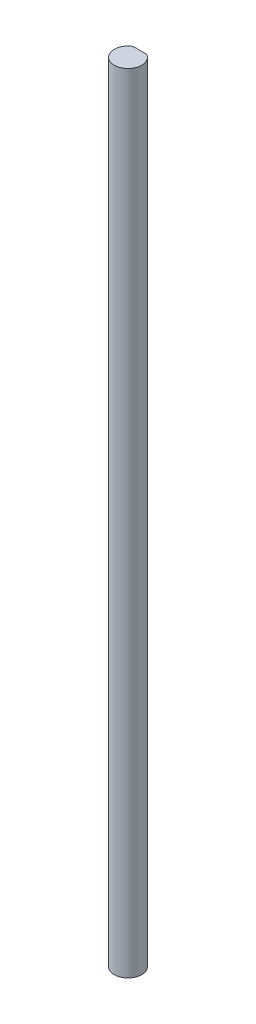
ISO-10303-21;
HEADER;
FILE_DESCRIPTION(('STEP AP214'),'2;1');
FILE_NAME('part.step','',(''),(''),'','','');
FILE_SCHEMA(('AUTOMOTIVE_DESIGN { 1 0 10303 214 1 1 1 1 }'));
ENDSEC;
DATA;
#1=APPLICATION_CONTEXT('core data for automotive mechanical design processes');
#2=APPLICATION_PROTOCOL_DEFINITION('international standard','automotive_design',2000,#1);
#3=PRODUCT_CONTEXT('',#1,'mechanical');
#4=PRODUCT('Part','Part','',(#3));
#5=PRODUCT_RELATED_PRODUCT_CATEGORY('part','',(#4));
#6=PRODUCT_DEFINITION_FORMATION('','',#4);
#7=PRODUCT_DEFINITION_CONTEXT('part definition',#1,'design');
#8=PRODUCT_DEFINITION('design','',#6,#7);
#9=PRODUCT_DEFINITION_SHAPE('','',#8);
#10=(LENGTH_UNIT() NAMED_UNIT(*) SI_UNIT(.MILLI.,.METRE.));
#11=(NAMED_UNIT(*) PLANE_ANGLE_UNIT() SI_UNIT($,.RADIAN.));
#12=(NAMED_UNIT(*) SI_UNIT($,.STERADIAN.) SOLID_ANGLE_UNIT());
#13=UNCERTAINTY_MEASURE_WITH_UNIT(LENGTH_MEASURE(1.E-05),#10,'distance_accuracy_value','');
#14=(GEOMETRIC_REPRESENTATION_CONTEXT(3) GLOBAL_UNCERTAINTY_ASSIGNED_CONTEXT((#13)) GLOBAL_UNIT_ASSIGNED_CONTEXT((#10,
#11,#12)) REPRESENTATION_CONTEXT('',''));
#15=CARTESIAN_POINT('',(0.,0.,0.));
#16=DIRECTION('',(0.,0.,1.));
#17=DIRECTION('',(1.,0.,0.));
#18=AXIS2_PLACEMENT_3D('',#15,#16,#17);
#19=CARTESIAN_POINT('',(0.,181.5,0.));
#20=DIRECTION('',(0.,-1.,0.));
#21=DIRECTION('',(0.,0.,-1.));
#22=AXIS2_PLACEMENT_3D('',#19,#20,#21);
#23=CYLINDRICAL_SURFACE('',#22,3.175);
#24=CARTESIAN_POINT('',(0.,0.,0.));
#25=DIRECTION('',(0.,1.,0.));
#26=DIRECTION('',(0.,0.,1.));
#27=AXIS2_PLACEMENT_3D('',#24,#25,#26);
#28=CIRCLE('',#27,3.175);
#29=CARTESIAN_POINT('',(-1.5875,0.,-2.74963065701559));
#30=VERTEX_POINT('',#29);
#31=CARTESIAN_POINT('',(1.5875,0.,-2.74963065701559));
#32=VERTEX_POINT('',#31);
#33=EDGE_CURVE('E75',#30,#32,#28,.T.);
#34=ORIENTED_EDGE('',*,*,#33,.T.);
#35=DIRECTION('',(0.,-1.,0.));
#36=VECTOR('',#35,1.);
#37=CARTESIAN_POINT('',(1.5875,181.5,-2.74963065701559));
#38=LINE('',#37,#36);
#39=CARTESIAN_POINT('',(1.5875,181.5,-2.74963065701559));
#40=VERTEX_POINT('',#39);
#41=EDGE_CURVE('E11',#40,#32,#38,.T.);
#42=ORIENTED_EDGE('',*,*,#41,.F.);
#43=CARTESIAN_POINT('',(0.,181.5,0.));
#44=DIRECTION('',(0.,1.,0.));
#45=DIRECTION('',(0.,0.,1.));
#46=AXIS2_PLACEMENT_3D('',#43,#44,#45);
#47=CIRCLE('',#46,3.175);
#48=CARTESIAN_POINT('',(-1.5875,181.5,-2.74963065701559));
#49=VERTEX_POINT('',#48);
#50=EDGE_CURVE('E74',#49,#40,#47,.T.);
#51=ORIENTED_EDGE('',*,*,#50,.F.);
#52=DIRECTION('',(0.,-1.,0.));
#53=VECTOR('',#52,1.);
#54=CARTESIAN_POINT('',(-1.5875,181.5,-2.74963065701559));
#55=LINE('',#54,#53);
#56=EDGE_CURVE('E51',#49,#30,#55,.T.);
#57=ORIENTED_EDGE('',*,*,#56,.T.);
#58=EDGE_LOOP('',(#34,#42,#51,#57));
#59=FACE_BOUND('',#58,.T.);
#60=ADVANCED_FACE('F42',(#59),#23,.T.);
#61=CARTESIAN_POINT('',(-1.5875,181.5,-2.74963065701559));
#62=DIRECTION('',(0.,0.,1.));
#63=DIRECTION('',(1.,0.,0.));
#64=AXIS2_PLACEMENT_3D('',#61,#62,#63);
#65=PLANE('',#64);
#66=DIRECTION('',(-1.,0.,0.));
#67=VECTOR('',#66,1.);
#68=CARTESIAN_POINT('',(-1.5875,0.,-2.74963065701559));
#69=LINE('',#68,#67);
#70=EDGE_CURVE('E66',#32,#30,#69,.T.);
#71=ORIENTED_EDGE('',*,*,#70,.T.);
#72=ORIENTED_EDGE('',*,*,#56,.F.);
#73=DIRECTION('',(-1.,0.,0.));
#74=VECTOR('',#73,1.);
#75=CARTESIAN_POINT('',(-1.5875,181.5,-2.74963065701559));
#76=LINE('',#75,#74);
#77=EDGE_CURVE('E58',#40,#49,#76,.T.);
#78=ORIENTED_EDGE('',*,*,#77,.F.);
#79=ORIENTED_EDGE('',*,*,#41,.T.);
#80=EDGE_LOOP('',(#71,#72,#78,#79));
#81=FACE_BOUND('',#80,.T.);
#82=ADVANCED_FACE('F69',(#81),#65,.F.);
#83=CARTESIAN_POINT('',(0.,181.5,0.));
#84=DIRECTION('',(0.,1.,0.));
#85=DIRECTION('',(0.,0.,1.));
#86=AXIS2_PLACEMENT_3D('',#83,#84,#85);
#87=PLANE('',#86);
#88=ORIENTED_EDGE('',*,*,#50,.T.);
#89=ORIENTED_EDGE('',*,*,#77,.T.);
#90=EDGE_LOOP('',(#88,#89));
#91=FACE_BOUND('',#90,.T.);
#92=ADVANCED_FACE('F86',(#91),#87,.T.);
#93=CARTESIAN_POINT('',(0.,0.,0.));
#94=DIRECTION('',(0.,1.,0.));
#95=DIRECTION('',(0.,0.,1.));
#96=AXIS2_PLACEMENT_3D('',#93,#94,#95);
#97=PLANE('',#96);
#98=ORIENTED_EDGE('',*,*,#33,.F.);
#99=ORIENTED_EDGE('',*,*,#70,.F.);
#100=EDGE_LOOP('',(#98,#99));
#101=FACE_BOUND('',#100,.T.);
#102=ADVANCED_FACE('F79',(#101),#97,.F.);
#103=CLOSED_SHELL('',(#60,#82,#92,#102));
#104=MANIFOLD_SOLID_BREP('B2',#103);
#105=ADVANCED_BREP_SHAPE_REPRESENTATION('',(#18,#104),#14);
#106=SHAPE_DEFINITION_REPRESENTATION(#9,#105);
ENDSEC;
END-ISO-10303-21;
